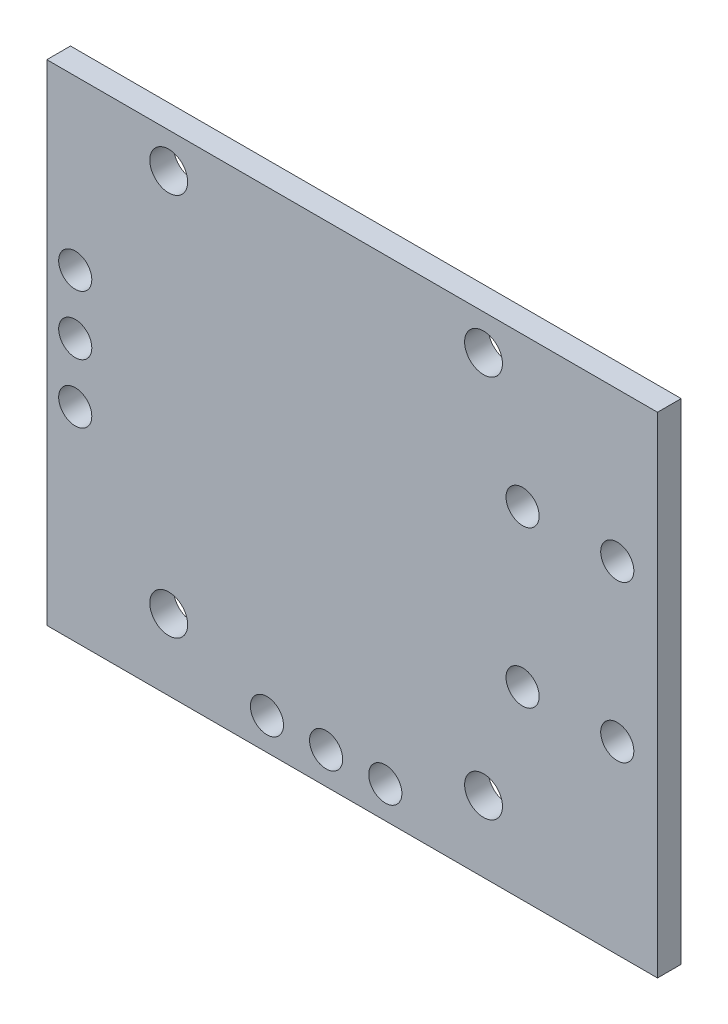
ISO-10303-21;
HEADER;
FILE_DESCRIPTION(('STEP AP214'),'2;1');
FILE_NAME('part.step','',(''),(''),'','','');
FILE_SCHEMA(('AUTOMOTIVE_DESIGN { 1 0 10303 214 1 1 1 1 }'));
ENDSEC;
DATA;
#1=APPLICATION_CONTEXT('core data for automotive mechanical design processes');
#2=APPLICATION_PROTOCOL_DEFINITION('international standard','automotive_design',2000,#1);
#3=PRODUCT_CONTEXT('',#1,'mechanical');
#4=PRODUCT('Part','Part','',(#3));
#5=PRODUCT_RELATED_PRODUCT_CATEGORY('part','',(#4));
#6=PRODUCT_DEFINITION_FORMATION('','',#4);
#7=PRODUCT_DEFINITION_CONTEXT('part definition',#1,'design');
#8=PRODUCT_DEFINITION('design','',#6,#7);
#9=PRODUCT_DEFINITION_SHAPE('','',#8);
#10=(LENGTH_UNIT() NAMED_UNIT(*) SI_UNIT(.MILLI.,.METRE.));
#11=(NAMED_UNIT(*) PLANE_ANGLE_UNIT() SI_UNIT($,.RADIAN.));
#12=(NAMED_UNIT(*) SI_UNIT($,.STERADIAN.) SOLID_ANGLE_UNIT());
#13=UNCERTAINTY_MEASURE_WITH_UNIT(LENGTH_MEASURE(1.E-05),#10,'distance_accuracy_value','');
#14=(GEOMETRIC_REPRESENTATION_CONTEXT(3) GLOBAL_UNCERTAINTY_ASSIGNED_CONTEXT((#13)) GLOBAL_UNIT_ASSIGNED_CONTEXT((#10,
#11,#12)) REPRESENTATION_CONTEXT('',''));
#15=CARTESIAN_POINT('',(0.,0.,0.));
#16=DIRECTION('',(0.,0.,1.));
#17=DIRECTION('',(1.,0.,0.));
#18=AXIS2_PLACEMENT_3D('',#15,#16,#17);
#19=CARTESIAN_POINT('',(25.8000000000003,-3.32966343707784E-13,1.));
#20=DIRECTION('',(1.,0.,0.));
#21=DIRECTION('',(0.,1.,0.));
#22=AXIS2_PLACEMENT_3D('',#19,#20,#21);
#23=PLANE('',#22);
#24=DIRECTION('',(0.,-1.,0.));
#25=VECTOR('',#24,1.);
#26=CARTESIAN_POINT('',(25.8000000000003,-3.32966343707784E-13,0.));
#27=LINE('',#26,#25);
#28=CARTESIAN_POINT('',(25.8000000000003,0.,0.));
#29=VERTEX_POINT('',#28);
#30=CARTESIAN_POINT('',(25.8,-20.7,0.));
#31=VERTEX_POINT('',#30);
#32=EDGE_CURVE('E144',#29,#31,#27,.T.);
#33=ORIENTED_EDGE('',*,*,#32,.F.);
#34=DIRECTION('',(0.,0.,-1.));
#35=VECTOR('',#34,1.);
#36=CARTESIAN_POINT('',(25.8000000000003,0.,1.));
#37=LINE('',#36,#35);
#38=CARTESIAN_POINT('',(25.8000000000003,0.,1.));
#39=VERTEX_POINT('',#38);
#40=EDGE_CURVE('E11',#39,#29,#37,.T.);
#41=ORIENTED_EDGE('',*,*,#40,.F.);
#42=DIRECTION('',(0.,-1.,0.));
#43=VECTOR('',#42,1.);
#44=CARTESIAN_POINT('',(25.8000000000003,-3.32966343707784E-13,1.));
#45=LINE('',#44,#43);
#46=CARTESIAN_POINT('',(25.8,-20.7,1.));
#47=VERTEX_POINT('',#46);
#48=EDGE_CURVE('E95',#39,#47,#45,.T.);
#49=ORIENTED_EDGE('',*,*,#48,.T.);
#50=DIRECTION('',(0.,0.,-1.));
#51=VECTOR('',#50,1.);
#52=CARTESIAN_POINT('',(25.8,-20.7,1.));
#53=LINE('',#52,#51);
#54=EDGE_CURVE('E74',#47,#31,#53,.T.);
#55=ORIENTED_EDGE('',*,*,#54,.T.);
#56=EDGE_LOOP('',(#33,#41,#49,#55));
#57=FACE_BOUND('',#56,.T.);
#58=ADVANCED_FACE('F34',(#57),#23,.T.);
#59=CARTESIAN_POINT('',(0.,0.,1.));
#60=DIRECTION('',(0.,1.,0.));
#61=DIRECTION('',(0.,0.,1.));
#62=AXIS2_PLACEMENT_3D('',#59,#60,#61);
#63=PLANE('',#62);
#64=DIRECTION('',(1.,0.,0.));
#65=VECTOR('',#64,1.);
#66=CARTESIAN_POINT('',(0.,0.,0.));
#67=LINE('',#66,#65);
#68=CARTESIAN_POINT('',(0.,0.,0.));
#69=VERTEX_POINT('',#68);
#70=EDGE_CURVE('E86',#69,#29,#67,.T.);
#71=ORIENTED_EDGE('',*,*,#70,.F.);
#72=DIRECTION('',(0.,0.,-1.));
#73=VECTOR('',#72,1.);
#74=CARTESIAN_POINT('',(0.,0.,1.));
#75=LINE('',#74,#73);
#76=CARTESIAN_POINT('',(0.,0.,1.));
#77=VERTEX_POINT('',#76);
#78=EDGE_CURVE('E43',#77,#69,#75,.T.);
#79=ORIENTED_EDGE('',*,*,#78,.F.);
#80=DIRECTION('',(1.,0.,0.));
#81=VECTOR('',#80,1.);
#82=CARTESIAN_POINT('',(0.,0.,1.));
#83=LINE('',#82,#81);
#84=EDGE_CURVE('E84',#77,#39,#83,.T.);
#85=ORIENTED_EDGE('',*,*,#84,.T.);
#86=ORIENTED_EDGE('',*,*,#40,.T.);
#87=EDGE_LOOP('',(#71,#79,#85,#86));
#88=FACE_BOUND('',#87,.T.);
#89=ADVANCED_FACE('F82',(#88),#63,.T.);
#90=CARTESIAN_POINT('',(0.,0.,1.));
#91=DIRECTION('',(1.,0.,0.));
#92=DIRECTION('',(0.,0.,-1.));
#93=AXIS2_PLACEMENT_3D('',#90,#91,#92);
#94=PLANE('',#93);
#95=DIRECTION('',(0.,-1.,0.));
#96=VECTOR('',#95,1.);
#97=CARTESIAN_POINT('',(0.,0.,0.));
#98=LINE('',#97,#96);
#99=CARTESIAN_POINT('',(0.,-20.7,0.));
#100=VERTEX_POINT('',#99);
#101=EDGE_CURVE('E147',#69,#100,#98,.T.);
#102=ORIENTED_EDGE('',*,*,#101,.T.);
#103=DIRECTION('',(0.,0.,-1.));
#104=VECTOR('',#103,1.);
#105=CARTESIAN_POINT('',(0.,-20.7,1.));
#106=LINE('',#105,#104);
#107=CARTESIAN_POINT('',(0.,-20.7,1.));
#108=VERTEX_POINT('',#107);
#109=EDGE_CURVE('E89',#108,#100,#106,.T.);
#110=ORIENTED_EDGE('',*,*,#109,.F.);
#111=DIRECTION('',(0.,-1.,0.));
#112=VECTOR('',#111,1.);
#113=CARTESIAN_POINT('',(0.,0.,1.));
#114=LINE('',#113,#112);
#115=EDGE_CURVE('E91',#77,#108,#114,.T.);
#116=ORIENTED_EDGE('',*,*,#115,.F.);
#117=ORIENTED_EDGE('',*,*,#78,.T.);
#118=EDGE_LOOP('',(#102,#110,#116,#117));
#119=FACE_BOUND('',#118,.T.);
#120=ADVANCED_FACE('F92',(#119),#94,.F.);
#121=CARTESIAN_POINT('',(1.2,-7.1,1.));
#122=DIRECTION('',(0.,0.,-1.));
#123=DIRECTION('',(-1.,0.,0.));
#124=AXIS2_PLACEMENT_3D('',#121,#122,#123);
#125=CYLINDRICAL_SURFACE('',#124,0.7);
#126=CARTESIAN_POINT('',(1.2,-7.1,1.));
#127=DIRECTION('',(0.,0.,1.));
#128=DIRECTION('',(1.,0.,0.));
#129=AXIS2_PLACEMENT_3D('',#126,#127,#128);
#130=CIRCLE('',#129,0.7);
#131=CARTESIAN_POINT('',(1.9,-7.1,1.));
#132=VERTEX_POINT('',#131);
#133=EDGE_CURVE('E97',#132,#132,#130,.T.);
#134=ORIENTED_EDGE('',*,*,#133,.T.);
#135=EDGE_LOOP('',(#134));
#136=FACE_BOUND('',#135,.T.);
#137=CARTESIAN_POINT('',(1.2,-7.1,0.));
#138=DIRECTION('',(0.,0.,1.));
#139=DIRECTION('',(1.,0.,0.));
#140=AXIS2_PLACEMENT_3D('',#137,#138,#139);
#141=CIRCLE('',#140,0.7);
#142=CARTESIAN_POINT('',(1.9,-7.1,0.));
#143=VERTEX_POINT('',#142);
#144=EDGE_CURVE('E141',#143,#143,#141,.T.);
#145=ORIENTED_EDGE('',*,*,#144,.F.);
#146=EDGE_LOOP('',(#145));
#147=FACE_BOUND('',#146,.T.);
#148=ADVANCED_FACE('F163',(#136,#147),#125,.F.);
#149=CARTESIAN_POINT('',(1.2,-9.6,1.));
#150=DIRECTION('',(0.,0.,-1.));
#151=DIRECTION('',(-1.,0.,0.));
#152=AXIS2_PLACEMENT_3D('',#149,#150,#151);
#153=CYLINDRICAL_SURFACE('',#152,0.7);
#154=CARTESIAN_POINT('',(1.2,-9.6,1.));
#155=DIRECTION('',(0.,0.,1.));
#156=DIRECTION('',(1.,0.,0.));
#157=AXIS2_PLACEMENT_3D('',#154,#155,#156);
#158=CIRCLE('',#157,0.7);
#159=CARTESIAN_POINT('',(1.9,-9.6,1.));
#160=VERTEX_POINT('',#159);
#161=EDGE_CURVE('E433',#160,#160,#158,.T.);
#162=ORIENTED_EDGE('',*,*,#161,.T.);
#163=EDGE_LOOP('',(#162));
#164=FACE_BOUND('',#163,.T.);
#165=CARTESIAN_POINT('',(1.2,-9.6,0.));
#166=DIRECTION('',(0.,0.,1.));
#167=DIRECTION('',(1.,0.,0.));
#168=AXIS2_PLACEMENT_3D('',#165,#166,#167);
#169=CIRCLE('',#168,0.7);
#170=CARTESIAN_POINT('',(1.9,-9.6,0.));
#171=VERTEX_POINT('',#170);
#172=EDGE_CURVE('E138',#171,#171,#169,.T.);
#173=ORIENTED_EDGE('',*,*,#172,.F.);
#174=EDGE_LOOP('',(#173));
#175=FACE_BOUND('',#174,.T.);
#176=ADVANCED_FACE('F166',(#164,#175),#153,.F.);
#177=CARTESIAN_POINT('',(1.2,-12.1,1.));
#178=DIRECTION('',(0.,0.,-1.));
#179=DIRECTION('',(-1.,0.,0.));
#180=AXIS2_PLACEMENT_3D('',#177,#178,#179);
#181=CYLINDRICAL_SURFACE('',#180,0.7);
#182=CARTESIAN_POINT('',(1.2,-12.1,1.));
#183=DIRECTION('',(0.,0.,1.));
#184=DIRECTION('',(1.,0.,0.));
#185=AXIS2_PLACEMENT_3D('',#182,#183,#184);
#186=CIRCLE('',#185,0.7);
#187=CARTESIAN_POINT('',(1.9,-12.1,1.));
#188=VERTEX_POINT('',#187);
#189=EDGE_CURVE('E429',#188,#188,#186,.T.);
#190=ORIENTED_EDGE('',*,*,#189,.T.);
#191=EDGE_LOOP('',(#190));
#192=FACE_BOUND('',#191,.T.);
#193=CARTESIAN_POINT('',(1.2,-12.1,0.));
#194=DIRECTION('',(0.,0.,1.));
#195=DIRECTION('',(1.,0.,0.));
#196=AXIS2_PLACEMENT_3D('',#193,#194,#195);
#197=CIRCLE('',#196,0.7);
#198=CARTESIAN_POINT('',(1.9,-12.1,0.));
#199=VERTEX_POINT('',#198);
#200=EDGE_CURVE('E135',#199,#199,#197,.T.);
#201=ORIENTED_EDGE('',*,*,#200,.F.);
#202=EDGE_LOOP('',(#201));
#203=FACE_BOUND('',#202,.T.);
#204=ADVANCED_FACE('F170',(#192,#203),#181,.F.);
#205=CARTESIAN_POINT('',(5.15,-17.7,1.));
#206=DIRECTION('',(0.,0.,-1.));
#207=DIRECTION('',(-1.,0.,0.));
#208=AXIS2_PLACEMENT_3D('',#205,#206,#207);
#209=CYLINDRICAL_SURFACE('',#208,0.8);
#210=CARTESIAN_POINT('',(5.15,-17.7,1.));
#211=DIRECTION('',(0.,0.,1.));
#212=DIRECTION('',(1.,0.,0.));
#213=AXIS2_PLACEMENT_3D('',#210,#211,#212);
#214=CIRCLE('',#213,0.8);
#215=CARTESIAN_POINT('',(5.95,-17.7,1.));
#216=VERTEX_POINT('',#215);
#217=EDGE_CURVE('E425',#216,#216,#214,.T.);
#218=ORIENTED_EDGE('',*,*,#217,.T.);
#219=EDGE_LOOP('',(#218));
#220=FACE_BOUND('',#219,.T.);
#221=CARTESIAN_POINT('',(5.15,-17.7,0.));
#222=DIRECTION('',(0.,0.,1.));
#223=DIRECTION('',(1.,0.,0.));
#224=AXIS2_PLACEMENT_3D('',#221,#222,#223);
#225=CIRCLE('',#224,0.8);
#226=CARTESIAN_POINT('',(5.95,-17.7,0.));
#227=VERTEX_POINT('',#226);
#228=EDGE_CURVE('E132',#227,#227,#225,.T.);
#229=ORIENTED_EDGE('',*,*,#228,.F.);
#230=EDGE_LOOP('',(#229));
#231=FACE_BOUND('',#230,.T.);
#232=ADVANCED_FACE('F174',(#220,#231),#209,.F.);
#233=CARTESIAN_POINT('',(5.15,-1.5,1.));
#234=DIRECTION('',(0.,0.,-1.));
#235=DIRECTION('',(-1.,0.,0.));
#236=AXIS2_PLACEMENT_3D('',#233,#234,#235);
#237=CYLINDRICAL_SURFACE('',#236,0.800000000000001);
#238=CARTESIAN_POINT('',(5.15,-1.5,1.));
#239=DIRECTION('',(0.,0.,1.));
#240=DIRECTION('',(1.,0.,0.));
#241=AXIS2_PLACEMENT_3D('',#238,#239,#240);
#242=CIRCLE('',#241,0.800000000000001);
#243=CARTESIAN_POINT('',(5.95,-1.5,1.));
#244=VERTEX_POINT('',#243);
#245=EDGE_CURVE('E421',#244,#244,#242,.T.);
#246=ORIENTED_EDGE('',*,*,#245,.T.);
#247=EDGE_LOOP('',(#246));
#248=FACE_BOUND('',#247,.T.);
#249=CARTESIAN_POINT('',(5.15,-1.5,0.));
#250=DIRECTION('',(0.,0.,1.));
#251=DIRECTION('',(1.,0.,0.));
#252=AXIS2_PLACEMENT_3D('',#249,#250,#251);
#253=CIRCLE('',#252,0.800000000000001);
#254=CARTESIAN_POINT('',(5.95,-1.5,0.));
#255=VERTEX_POINT('',#254);
#256=EDGE_CURVE('E129',#255,#255,#253,.T.);
#257=ORIENTED_EDGE('',*,*,#256,.F.);
#258=EDGE_LOOP('',(#257));
#259=FACE_BOUND('',#258,.T.);
#260=ADVANCED_FACE('F178',(#248,#259),#237,.F.);
#261=CARTESIAN_POINT('',(18.45,-1.5,1.));
#262=DIRECTION('',(0.,0.,-1.));
#263=DIRECTION('',(-1.,0.,0.));
#264=AXIS2_PLACEMENT_3D('',#261,#262,#263);
#265=CYLINDRICAL_SURFACE('',#264,0.799999999999999);
#266=CARTESIAN_POINT('',(18.45,-1.5,1.));
#267=DIRECTION('',(0.,0.,1.));
#268=DIRECTION('',(1.,0.,0.));
#269=AXIS2_PLACEMENT_3D('',#266,#267,#268);
#270=CIRCLE('',#269,0.799999999999999);
#271=CARTESIAN_POINT('',(19.25,-1.5,1.));
#272=VERTEX_POINT('',#271);
#273=EDGE_CURVE('E417',#272,#272,#270,.T.);
#274=ORIENTED_EDGE('',*,*,#273,.T.);
#275=EDGE_LOOP('',(#274));
#276=FACE_BOUND('',#275,.T.);
#277=CARTESIAN_POINT('',(18.45,-1.5,0.));
#278=DIRECTION('',(0.,0.,1.));
#279=DIRECTION('',(1.,0.,0.));
#280=AXIS2_PLACEMENT_3D('',#277,#278,#279);
#281=CIRCLE('',#280,0.799999999999999);
#282=CARTESIAN_POINT('',(19.25,-1.5,0.));
#283=VERTEX_POINT('',#282);
#284=EDGE_CURVE('E126',#283,#283,#281,.T.);
#285=ORIENTED_EDGE('',*,*,#284,.F.);
#286=EDGE_LOOP('',(#285));
#287=FACE_BOUND('',#286,.T.);
#288=ADVANCED_FACE('F182',(#276,#287),#265,.F.);
#289=CARTESIAN_POINT('',(18.45,-17.7,1.));
#290=DIRECTION('',(0.,0.,-1.));
#291=DIRECTION('',(-1.,0.,0.));
#292=AXIS2_PLACEMENT_3D('',#289,#290,#291);
#293=CYLINDRICAL_SURFACE('',#292,0.799999999999999);
#294=CARTESIAN_POINT('',(18.45,-17.7,1.));
#295=DIRECTION('',(0.,0.,1.));
#296=DIRECTION('',(1.,0.,0.));
#297=AXIS2_PLACEMENT_3D('',#294,#295,#296);
#298=CIRCLE('',#297,0.799999999999999);
#299=CARTESIAN_POINT('',(19.25,-17.7,1.));
#300=VERTEX_POINT('',#299);
#301=EDGE_CURVE('E413',#300,#300,#298,.T.);
#302=ORIENTED_EDGE('',*,*,#301,.T.);
#303=EDGE_LOOP('',(#302));
#304=FACE_BOUND('',#303,.T.);
#305=CARTESIAN_POINT('',(18.45,-17.7,0.));
#306=DIRECTION('',(0.,0.,1.));
#307=DIRECTION('',(1.,0.,0.));
#308=AXIS2_PLACEMENT_3D('',#305,#306,#307);
#309=CIRCLE('',#308,0.799999999999999);
#310=CARTESIAN_POINT('',(19.25,-17.7,0.));
#311=VERTEX_POINT('',#310);
#312=EDGE_CURVE('E123',#311,#311,#309,.T.);
#313=ORIENTED_EDGE('',*,*,#312,.F.);
#314=EDGE_LOOP('',(#313));
#315=FACE_BOUND('',#314,.T.);
#316=ADVANCED_FACE('F186',(#304,#315),#293,.F.);
#317=CARTESIAN_POINT('',(9.3,-19.3500000000001,1.));
#318=DIRECTION('',(0.,0.,-1.));
#319=DIRECTION('',(-1.,0.,0.));
#320=AXIS2_PLACEMENT_3D('',#317,#318,#319);
#321=CYLINDRICAL_SURFACE('',#320,0.699999999999999);
#322=CARTESIAN_POINT('',(9.3,-19.3500000000001,1.));
#323=DIRECTION('',(0.,0.,1.));
#324=DIRECTION('',(1.,0.,0.));
#325=AXIS2_PLACEMENT_3D('',#322,#323,#324);
#326=CIRCLE('',#325,0.699999999999999);
#327=CARTESIAN_POINT('',(10.,-19.3500000000001,1.));
#328=VERTEX_POINT('',#327);
#329=EDGE_CURVE('E409',#328,#328,#326,.T.);
#330=ORIENTED_EDGE('',*,*,#329,.T.);
#331=EDGE_LOOP('',(#330));
#332=FACE_BOUND('',#331,.T.);
#333=CARTESIAN_POINT('',(9.3,-19.3500000000001,0.));
#334=DIRECTION('',(0.,0.,1.));
#335=DIRECTION('',(1.,0.,0.));
#336=AXIS2_PLACEMENT_3D('',#333,#334,#335);
#337=CIRCLE('',#336,0.699999999999999);
#338=CARTESIAN_POINT('',(10.,-19.3500000000001,0.));
#339=VERTEX_POINT('',#338);
#340=EDGE_CURVE('E120',#339,#339,#337,.T.);
#341=ORIENTED_EDGE('',*,*,#340,.F.);
#342=EDGE_LOOP('',(#341));
#343=FACE_BOUND('',#342,.T.);
#344=ADVANCED_FACE('F190',(#332,#343),#321,.F.);
#345=CARTESIAN_POINT('',(11.8,-19.3500000000001,1.));
#346=DIRECTION('',(0.,0.,-1.));
#347=DIRECTION('',(-1.,0.,0.));
#348=AXIS2_PLACEMENT_3D('',#345,#346,#347);
#349=CYLINDRICAL_SURFACE('',#348,0.699999999999999);
#350=CARTESIAN_POINT('',(11.8,-19.3500000000001,1.));
#351=DIRECTION('',(0.,0.,1.));
#352=DIRECTION('',(1.,0.,0.));
#353=AXIS2_PLACEMENT_3D('',#350,#351,#352);
#354=CIRCLE('',#353,0.699999999999999);
#355=CARTESIAN_POINT('',(12.5,-19.3500000000001,1.));
#356=VERTEX_POINT('',#355);
#357=EDGE_CURVE('E405',#356,#356,#354,.T.);
#358=ORIENTED_EDGE('',*,*,#357,.T.);
#359=EDGE_LOOP('',(#358));
#360=FACE_BOUND('',#359,.T.);
#361=CARTESIAN_POINT('',(11.8,-19.3500000000001,0.));
#362=DIRECTION('',(0.,0.,1.));
#363=DIRECTION('',(1.,0.,0.));
#364=AXIS2_PLACEMENT_3D('',#361,#362,#363);
#365=CIRCLE('',#364,0.699999999999999);
#366=CARTESIAN_POINT('',(12.5,-19.3500000000001,0.));
#367=VERTEX_POINT('',#366);
#368=EDGE_CURVE('E117',#367,#367,#365,.T.);
#369=ORIENTED_EDGE('',*,*,#368,.F.);
#370=EDGE_LOOP('',(#369));
#371=FACE_BOUND('',#370,.T.);
#372=ADVANCED_FACE('F194',(#360,#371),#349,.F.);
#373=CARTESIAN_POINT('',(20.1,-6.3,1.));
#374=DIRECTION('',(0.,0.,-1.));
#375=DIRECTION('',(-1.,0.,0.));
#376=AXIS2_PLACEMENT_3D('',#373,#374,#375);
#377=CYLINDRICAL_SURFACE('',#376,0.699999999999998);
#378=CARTESIAN_POINT('',(20.1,-6.3,1.));
#379=DIRECTION('',(0.,0.,1.));
#380=DIRECTION('',(1.,0.,0.));
#381=AXIS2_PLACEMENT_3D('',#378,#379,#380);
#382=CIRCLE('',#381,0.699999999999998);
#383=CARTESIAN_POINT('',(20.8,-6.3,1.));
#384=VERTEX_POINT('',#383);
#385=EDGE_CURVE('E401',#384,#384,#382,.T.);
#386=ORIENTED_EDGE('',*,*,#385,.T.);
#387=EDGE_LOOP('',(#386));
#388=FACE_BOUND('',#387,.T.);
#389=CARTESIAN_POINT('',(20.1,-6.3,0.));
#390=DIRECTION('',(0.,0.,1.));
#391=DIRECTION('',(1.,0.,0.));
#392=AXIS2_PLACEMENT_3D('',#389,#390,#391);
#393=CIRCLE('',#392,0.699999999999998);
#394=CARTESIAN_POINT('',(20.8,-6.3,0.));
#395=VERTEX_POINT('',#394);
#396=EDGE_CURVE('E114',#395,#395,#393,.T.);
#397=ORIENTED_EDGE('',*,*,#396,.F.);
#398=EDGE_LOOP('',(#397));
#399=FACE_BOUND('',#398,.T.);
#400=ADVANCED_FACE('F198',(#388,#399),#377,.F.);
#401=CARTESIAN_POINT('',(24.1,-6.3,1.));
#402=DIRECTION('',(0.,0.,-1.));
#403=DIRECTION('',(-1.,0.,0.));
#404=AXIS2_PLACEMENT_3D('',#401,#402,#403);
#405=CYLINDRICAL_SURFACE('',#404,0.699999999999998);
#406=CARTESIAN_POINT('',(24.1,-6.3,1.));
#407=DIRECTION('',(0.,0.,1.));
#408=DIRECTION('',(1.,0.,0.));
#409=AXIS2_PLACEMENT_3D('',#406,#407,#408);
#410=CIRCLE('',#409,0.699999999999998);
#411=CARTESIAN_POINT('',(24.8,-6.3,1.));
#412=VERTEX_POINT('',#411);
#413=EDGE_CURVE('E397',#412,#412,#410,.T.);
#414=ORIENTED_EDGE('',*,*,#413,.T.);
#415=EDGE_LOOP('',(#414));
#416=FACE_BOUND('',#415,.T.);
#417=CARTESIAN_POINT('',(24.1,-6.3,0.));
#418=DIRECTION('',(0.,0.,1.));
#419=DIRECTION('',(1.,0.,0.));
#420=AXIS2_PLACEMENT_3D('',#417,#418,#419);
#421=CIRCLE('',#420,0.699999999999998);
#422=CARTESIAN_POINT('',(24.8,-6.3,0.));
#423=VERTEX_POINT('',#422);
#424=EDGE_CURVE('E111',#423,#423,#421,.T.);
#425=ORIENTED_EDGE('',*,*,#424,.F.);
#426=EDGE_LOOP('',(#425));
#427=FACE_BOUND('',#426,.T.);
#428=ADVANCED_FACE('F202',(#416,#427),#405,.F.);
#429=CARTESIAN_POINT('',(20.1,-12.9,1.));
#430=DIRECTION('',(0.,0.,-1.));
#431=DIRECTION('',(-1.,0.,0.));
#432=AXIS2_PLACEMENT_3D('',#429,#430,#431);
#433=CYLINDRICAL_SURFACE('',#432,0.699999999999998);
#434=CARTESIAN_POINT('',(20.1,-12.9,1.));
#435=DIRECTION('',(0.,0.,1.));
#436=DIRECTION('',(1.,0.,0.));
#437=AXIS2_PLACEMENT_3D('',#434,#435,#436);
#438=CIRCLE('',#437,0.699999999999998);
#439=CARTESIAN_POINT('',(20.8,-12.9,1.));
#440=VERTEX_POINT('',#439);
#441=EDGE_CURVE('E393',#440,#440,#438,.T.);
#442=ORIENTED_EDGE('',*,*,#441,.T.);
#443=EDGE_LOOP('',(#442));
#444=FACE_BOUND('',#443,.T.);
#445=CARTESIAN_POINT('',(20.1,-12.9,0.));
#446=DIRECTION('',(0.,0.,1.));
#447=DIRECTION('',(1.,0.,0.));
#448=AXIS2_PLACEMENT_3D('',#445,#446,#447);
#449=CIRCLE('',#448,0.699999999999998);
#450=CARTESIAN_POINT('',(20.8,-12.9,0.));
#451=VERTEX_POINT('',#450);
#452=EDGE_CURVE('E108',#451,#451,#449,.T.);
#453=ORIENTED_EDGE('',*,*,#452,.F.);
#454=EDGE_LOOP('',(#453));
#455=FACE_BOUND('',#454,.T.);
#456=ADVANCED_FACE('F206',(#444,#455),#433,.F.);
#457=CARTESIAN_POINT('',(24.1,-12.9,1.));
#458=DIRECTION('',(0.,0.,-1.));
#459=DIRECTION('',(-1.,0.,0.));
#460=AXIS2_PLACEMENT_3D('',#457,#458,#459);
#461=CYLINDRICAL_SURFACE('',#460,0.699999999999998);
#462=CARTESIAN_POINT('',(24.1,-12.9,1.));
#463=DIRECTION('',(0.,0.,1.));
#464=DIRECTION('',(1.,0.,0.));
#465=AXIS2_PLACEMENT_3D('',#462,#463,#464);
#466=CIRCLE('',#465,0.699999999999998);
#467=CARTESIAN_POINT('',(24.8,-12.9,1.));
#468=VERTEX_POINT('',#467);
#469=EDGE_CURVE('E220',#468,#468,#466,.T.);
#470=ORIENTED_EDGE('',*,*,#469,.T.);
#471=EDGE_LOOP('',(#470));
#472=FACE_BOUND('',#471,.T.);
#473=CARTESIAN_POINT('',(24.1,-12.9,0.));
#474=DIRECTION('',(0.,0.,1.));
#475=DIRECTION('',(1.,0.,0.));
#476=AXIS2_PLACEMENT_3D('',#473,#474,#475);
#477=CIRCLE('',#476,0.699999999999998);
#478=CARTESIAN_POINT('',(24.8,-12.9,0.));
#479=VERTEX_POINT('',#478);
#480=EDGE_CURVE('E105',#479,#479,#477,.T.);
#481=ORIENTED_EDGE('',*,*,#480,.F.);
#482=EDGE_LOOP('',(#481));
#483=FACE_BOUND('',#482,.T.);
#484=ADVANCED_FACE('F209',(#472,#483),#461,.F.);
#485=CARTESIAN_POINT('',(14.3,-19.3500000000001,1.));
#486=DIRECTION('',(0.,0.,-1.));
#487=DIRECTION('',(-1.,0.,0.));
#488=AXIS2_PLACEMENT_3D('',#485,#486,#487);
#489=CYLINDRICAL_SURFACE('',#488,0.699999999999999);
#490=CARTESIAN_POINT('',(14.3,-19.3500000000001,1.));
#491=DIRECTION('',(0.,0.,1.));
#492=DIRECTION('',(1.,0.,0.));
#493=AXIS2_PLACEMENT_3D('',#490,#491,#492);
#494=CIRCLE('',#493,0.699999999999999);
#495=CARTESIAN_POINT('',(15.,-19.3500000000001,1.));
#496=VERTEX_POINT('',#495);
#497=EDGE_CURVE('E150',#496,#496,#494,.T.);
#498=ORIENTED_EDGE('',*,*,#497,.T.);
#499=EDGE_LOOP('',(#498));
#500=FACE_BOUND('',#499,.T.);
#501=CARTESIAN_POINT('',(14.3,-19.3500000000001,0.));
#502=DIRECTION('',(0.,0.,1.));
#503=DIRECTION('',(1.,0.,0.));
#504=AXIS2_PLACEMENT_3D('',#501,#502,#503);
#505=CIRCLE('',#504,0.699999999999999);
#506=CARTESIAN_POINT('',(15.,-19.3500000000001,0.));
#507=VERTEX_POINT('',#506);
#508=EDGE_CURVE('E102',#507,#507,#505,.T.);
#509=ORIENTED_EDGE('',*,*,#508,.F.);
#510=EDGE_LOOP('',(#509));
#511=FACE_BOUND('',#510,.T.);
#512=ADVANCED_FACE('F36',(#500,#511),#489,.F.);
#513=CARTESIAN_POINT('',(0.,-20.7,1.));
#514=DIRECTION('',(0.,1.,0.));
#515=DIRECTION('',(0.,0.,1.));
#516=AXIS2_PLACEMENT_3D('',#513,#514,#515);
#517=PLANE('',#516);
#518=DIRECTION('',(1.,0.,0.));
#519=VECTOR('',#518,1.);
#520=CARTESIAN_POINT('',(0.,-20.7,0.));
#521=LINE('',#520,#519);
#522=EDGE_CURVE('E67',#100,#31,#521,.T.);
#523=ORIENTED_EDGE('',*,*,#522,.T.);
#524=ORIENTED_EDGE('',*,*,#54,.F.);
#525=DIRECTION('',(1.,0.,0.));
#526=VECTOR('',#525,1.);
#527=CARTESIAN_POINT('',(0.,-20.7,1.));
#528=LINE('',#527,#526);
#529=EDGE_CURVE('E51',#108,#47,#528,.T.);
#530=ORIENTED_EDGE('',*,*,#529,.F.);
#531=ORIENTED_EDGE('',*,*,#109,.T.);
#532=EDGE_LOOP('',(#523,#524,#530,#531));
#533=FACE_BOUND('',#532,.T.);
#534=ADVANCED_FACE('F153',(#533),#517,.F.);
#535=CARTESIAN_POINT('',(0.,0.,1.));
#536=DIRECTION('',(0.,0.,1.));
#537=DIRECTION('',(1.,0.,0.));
#538=AXIS2_PLACEMENT_3D('',#535,#536,#537);
#539=PLANE('',#538);
#540=ORIENTED_EDGE('',*,*,#497,.F.);
#541=EDGE_LOOP('',(#540));
#542=FACE_BOUND('',#541,.T.);
#543=ORIENTED_EDGE('',*,*,#469,.F.);
#544=EDGE_LOOP('',(#543));
#545=FACE_BOUND('',#544,.T.);
#546=ORIENTED_EDGE('',*,*,#441,.F.);
#547=EDGE_LOOP('',(#546));
#548=FACE_BOUND('',#547,.T.);
#549=ORIENTED_EDGE('',*,*,#413,.F.);
#550=EDGE_LOOP('',(#549));
#551=FACE_BOUND('',#550,.T.);
#552=ORIENTED_EDGE('',*,*,#385,.F.);
#553=EDGE_LOOP('',(#552));
#554=FACE_BOUND('',#553,.T.);
#555=ORIENTED_EDGE('',*,*,#357,.F.);
#556=EDGE_LOOP('',(#555));
#557=FACE_BOUND('',#556,.T.);
#558=ORIENTED_EDGE('',*,*,#329,.F.);
#559=EDGE_LOOP('',(#558));
#560=FACE_BOUND('',#559,.T.);
#561=ORIENTED_EDGE('',*,*,#301,.F.);
#562=EDGE_LOOP('',(#561));
#563=FACE_BOUND('',#562,.T.);
#564=ORIENTED_EDGE('',*,*,#273,.F.);
#565=EDGE_LOOP('',(#564));
#566=FACE_BOUND('',#565,.T.);
#567=ORIENTED_EDGE('',*,*,#245,.F.);
#568=EDGE_LOOP('',(#567));
#569=FACE_BOUND('',#568,.T.);
#570=ORIENTED_EDGE('',*,*,#217,.F.);
#571=EDGE_LOOP('',(#570));
#572=FACE_BOUND('',#571,.T.);
#573=ORIENTED_EDGE('',*,*,#189,.F.);
#574=EDGE_LOOP('',(#573));
#575=FACE_BOUND('',#574,.T.);
#576=ORIENTED_EDGE('',*,*,#161,.F.);
#577=EDGE_LOOP('',(#576));
#578=FACE_BOUND('',#577,.T.);
#579=ORIENTED_EDGE('',*,*,#133,.F.);
#580=EDGE_LOOP('',(#579));
#581=FACE_BOUND('',#580,.T.);
#582=ORIENTED_EDGE('',*,*,#48,.F.);
#583=ORIENTED_EDGE('',*,*,#84,.F.);
#584=ORIENTED_EDGE('',*,*,#115,.T.);
#585=ORIENTED_EDGE('',*,*,#529,.T.);
#586=EDGE_LOOP('',(#582,#583,#584,#585));
#587=FACE_BOUND('',#586,.T.);
#588=ADVANCED_FACE('F94',(#542,#545,#548,#551,#554,#557,#560,#563,#566,#569,#572,#575,#578,#581,
#587),#539,.T.);
#589=CARTESIAN_POINT('',(0.,0.,0.));
#590=DIRECTION('',(0.,0.,1.));
#591=DIRECTION('',(1.,0.,0.));
#592=AXIS2_PLACEMENT_3D('',#589,#590,#591);
#593=PLANE('',#592);
#594=ORIENTED_EDGE('',*,*,#508,.T.);
#595=EDGE_LOOP('',(#594));
#596=FACE_BOUND('',#595,.T.);
#597=ORIENTED_EDGE('',*,*,#480,.T.);
#598=EDGE_LOOP('',(#597));
#599=FACE_BOUND('',#598,.T.);
#600=ORIENTED_EDGE('',*,*,#452,.T.);
#601=EDGE_LOOP('',(#600));
#602=FACE_BOUND('',#601,.T.);
#603=ORIENTED_EDGE('',*,*,#424,.T.);
#604=EDGE_LOOP('',(#603));
#605=FACE_BOUND('',#604,.T.);
#606=ORIENTED_EDGE('',*,*,#396,.T.);
#607=EDGE_LOOP('',(#606));
#608=FACE_BOUND('',#607,.T.);
#609=ORIENTED_EDGE('',*,*,#368,.T.);
#610=EDGE_LOOP('',(#609));
#611=FACE_BOUND('',#610,.T.);
#612=ORIENTED_EDGE('',*,*,#340,.T.);
#613=EDGE_LOOP('',(#612));
#614=FACE_BOUND('',#613,.T.);
#615=ORIENTED_EDGE('',*,*,#312,.T.);
#616=EDGE_LOOP('',(#615));
#617=FACE_BOUND('',#616,.T.);
#618=ORIENTED_EDGE('',*,*,#284,.T.);
#619=EDGE_LOOP('',(#618));
#620=FACE_BOUND('',#619,.T.);
#621=ORIENTED_EDGE('',*,*,#256,.T.);
#622=EDGE_LOOP('',(#621));
#623=FACE_BOUND('',#622,.T.);
#624=ORIENTED_EDGE('',*,*,#228,.T.);
#625=EDGE_LOOP('',(#624));
#626=FACE_BOUND('',#625,.T.);
#627=ORIENTED_EDGE('',*,*,#200,.T.);
#628=EDGE_LOOP('',(#627));
#629=FACE_BOUND('',#628,.T.);
#630=ORIENTED_EDGE('',*,*,#172,.T.);
#631=EDGE_LOOP('',(#630));
#632=FACE_BOUND('',#631,.T.);
#633=ORIENTED_EDGE('',*,*,#144,.T.);
#634=EDGE_LOOP('',(#633));
#635=FACE_BOUND('',#634,.T.);
#636=ORIENTED_EDGE('',*,*,#32,.T.);
#637=ORIENTED_EDGE('',*,*,#522,.F.);
#638=ORIENTED_EDGE('',*,*,#101,.F.);
#639=ORIENTED_EDGE('',*,*,#70,.T.);
#640=EDGE_LOOP('',(#636,#637,#638,#639));
#641=FACE_BOUND('',#640,.T.);
#642=ADVANCED_FACE('F154',(#596,#599,#602,#605,#608,#611,#614,#617,#620,#623,#626,#629,#632,
#635,#641),#593,.F.);
#643=CLOSED_SHELL('',(#58,#89,#120,#148,#176,#204,#232,#260,#288,#316,#344,#372,#400,#428,#456,
#484,#512,#534,#588,#642));
#644=MANIFOLD_SOLID_BREP('B2',#643);
#645=ADVANCED_BREP_SHAPE_REPRESENTATION('',(#18,#644),#14);
#646=SHAPE_DEFINITION_REPRESENTATION(#9,#645);
ENDSEC;
END-ISO-10303-21;
